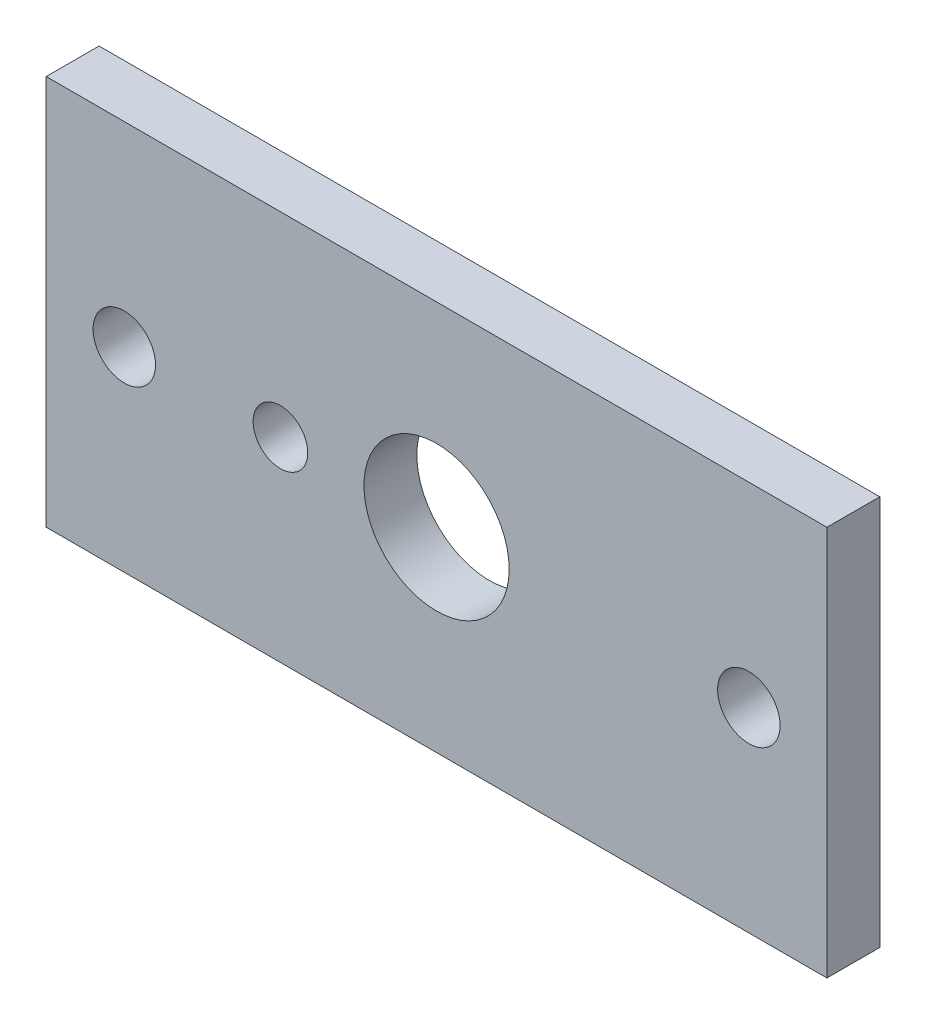
ISO-10303-21;
HEADER;
FILE_DESCRIPTION(('STEP AP214'),'2;1');
FILE_NAME('part.step','',(''),(''),'','','');
FILE_SCHEMA(('AUTOMOTIVE_DESIGN { 1 0 10303 214 1 1 1 1 }'));
ENDSEC;
DATA;
#1=APPLICATION_CONTEXT('core data for automotive mechanical design processes');
#2=APPLICATION_PROTOCOL_DEFINITION('international standard','automotive_design',2000,#1);
#3=PRODUCT_CONTEXT('',#1,'mechanical');
#4=PRODUCT('Part','Part','',(#3));
#5=PRODUCT_RELATED_PRODUCT_CATEGORY('part','',(#4));
#6=PRODUCT_DEFINITION_FORMATION('','',#4);
#7=PRODUCT_DEFINITION_CONTEXT('part definition',#1,'design');
#8=PRODUCT_DEFINITION('design','',#6,#7);
#9=PRODUCT_DEFINITION_SHAPE('','',#8);
#10=(LENGTH_UNIT() NAMED_UNIT(*) SI_UNIT(.MILLI.,.METRE.));
#11=(NAMED_UNIT(*) PLANE_ANGLE_UNIT() SI_UNIT($,.RADIAN.));
#12=(NAMED_UNIT(*) SI_UNIT($,.STERADIAN.) SOLID_ANGLE_UNIT());
#13=UNCERTAINTY_MEASURE_WITH_UNIT(LENGTH_MEASURE(1.E-05),#10,'distance_accuracy_value','');
#14=(GEOMETRIC_REPRESENTATION_CONTEXT(3) GLOBAL_UNCERTAINTY_ASSIGNED_CONTEXT((#13)) GLOBAL_UNIT_ASSIGNED_CONTEXT((#10,
#11,#12)) REPRESENTATION_CONTEXT('',''));
#15=CARTESIAN_POINT('',(0.,0.,0.));
#16=DIRECTION('',(0.,0.,1.));
#17=DIRECTION('',(1.,0.,0.));
#18=AXIS2_PLACEMENT_3D('',#15,#16,#17);
#19=CARTESIAN_POINT('',(0.,0.,3.385));
#20=DIRECTION('',(0.,0.,1.));
#21=DIRECTION('',(1.,0.,0.));
#22=AXIS2_PLACEMENT_3D('',#19,#20,#21);
#23=PLANE('',#22);
#24=CARTESIAN_POINT('',(20.,0.,3.385));
#25=DIRECTION('',(0.,0.,1.));
#26=DIRECTION('',(1.,0.,0.));
#27=AXIS2_PLACEMENT_3D('',#24,#25,#26);
#28=CIRCLE('',#27,2.);
#29=CARTESIAN_POINT('',(22.,0.,3.385));
#30=VERTEX_POINT('',#29);
#31=EDGE_CURVE('E124',#30,#30,#28,.T.);
#32=ORIENTED_EDGE('',*,*,#31,.F.);
#33=EDGE_LOOP('',(#32));
#34=FACE_BOUND('',#33,.T.);
#35=CARTESIAN_POINT('',(0.,0.,3.385));
#36=DIRECTION('',(0.,0.,1.));
#37=DIRECTION('',(1.,0.,0.));
#38=AXIS2_PLACEMENT_3D('',#35,#36,#37);
#39=CIRCLE('',#38,4.65);
#40=CARTESIAN_POINT('',(4.65000000000006,0.,3.385));
#41=VERTEX_POINT('',#40);
#42=EDGE_CURVE('E103',#41,#41,#39,.T.);
#43=ORIENTED_EDGE('',*,*,#42,.F.);
#44=EDGE_LOOP('',(#43));
#45=FACE_BOUND('',#44,.T.);
#46=DIRECTION('',(0.,1.,0.));
#47=VECTOR('',#46,1.);
#48=CARTESIAN_POINT('',(25.,12.5,3.385));
#49=LINE('',#48,#47);
#50=CARTESIAN_POINT('',(25.,-12.5,3.385));
#51=VERTEX_POINT('',#50);
#52=CARTESIAN_POINT('',(25.,12.5,3.385));
#53=VERTEX_POINT('',#52);
#54=EDGE_CURVE('E88',#51,#53,#49,.T.);
#55=ORIENTED_EDGE('',*,*,#54,.T.);
#56=DIRECTION('',(-1.,0.,0.));
#57=VECTOR('',#56,1.);
#58=CARTESIAN_POINT('',(-25.,12.5,3.385));
#59=LINE('',#58,#57);
#60=CARTESIAN_POINT('',(-25.,12.5,3.385));
#61=VERTEX_POINT('',#60);
#62=EDGE_CURVE('E83',#53,#61,#59,.T.);
#63=ORIENTED_EDGE('',*,*,#62,.T.);
#64=DIRECTION('',(0.,-1.,0.));
#65=VECTOR('',#64,1.);
#66=CARTESIAN_POINT('',(-25.,12.5,3.385));
#67=LINE('',#66,#65);
#68=CARTESIAN_POINT('',(-25.,-12.5,3.385));
#69=VERTEX_POINT('',#68);
#70=EDGE_CURVE('E86',#61,#69,#67,.T.);
#71=ORIENTED_EDGE('',*,*,#70,.T.);
#72=DIRECTION('',(1.,0.,0.));
#73=VECTOR('',#72,1.);
#74=CARTESIAN_POINT('',(-25.,-12.5,3.385));
#75=LINE('',#74,#73);
#76=EDGE_CURVE('E53',#69,#51,#75,.T.);
#77=ORIENTED_EDGE('',*,*,#76,.T.);
#78=EDGE_LOOP('',(#55,#63,#71,#77));
#79=FACE_BOUND('',#78,.T.);
#80=CARTESIAN_POINT('',(-10.,0.,3.385));
#81=DIRECTION('',(0.,0.,1.));
#82=DIRECTION('',(1.,0.,0.));
#83=AXIS2_PLACEMENT_3D('',#80,#81,#82);
#84=CIRCLE('',#83,1.75);
#85=CARTESIAN_POINT('',(-8.25,0.,3.385));
#86=VERTEX_POINT('',#85);
#87=EDGE_CURVE('E118',#86,#86,#84,.T.);
#88=ORIENTED_EDGE('',*,*,#87,.F.);
#89=EDGE_LOOP('',(#88));
#90=FACE_BOUND('',#89,.T.);
#91=CARTESIAN_POINT('',(-20.,0.,3.385));
#92=DIRECTION('',(0.,0.,1.));
#93=DIRECTION('',(1.,0.,0.));
#94=AXIS2_PLACEMENT_3D('',#91,#92,#93);
#95=CIRCLE('',#94,2.);
#96=CARTESIAN_POINT('',(-18.,0.,3.385));
#97=VERTEX_POINT('',#96);
#98=EDGE_CURVE('E130',#97,#97,#95,.T.);
#99=ORIENTED_EDGE('',*,*,#98,.F.);
#100=EDGE_LOOP('',(#99));
#101=FACE_BOUND('',#100,.T.);
#102=ADVANCED_FACE('F36',(#34,#45,#79,#90,#101),#23,.T.);
#103=CARTESIAN_POINT('',(0.,0.,0.));
#104=DIRECTION('',(0.,0.,1.));
#105=DIRECTION('',(1.,0.,0.));
#106=AXIS2_PLACEMENT_3D('',#103,#104,#105);
#107=PLANE('',#106);
#108=DIRECTION('',(0.,1.,0.));
#109=VECTOR('',#108,1.);
#110=CARTESIAN_POINT('',(25.,12.5,0.));
#111=LINE('',#110,#109);
#112=CARTESIAN_POINT('',(25.,-12.5,0.));
#113=VERTEX_POINT('',#112);
#114=CARTESIAN_POINT('',(25.,12.5,0.));
#115=VERTEX_POINT('',#114);
#116=EDGE_CURVE('E100',#113,#115,#111,.T.);
#117=ORIENTED_EDGE('',*,*,#116,.F.);
#118=DIRECTION('',(1.,0.,0.));
#119=VECTOR('',#118,1.);
#120=CARTESIAN_POINT('',(-25.,-12.5,0.));
#121=LINE('',#120,#119);
#122=CARTESIAN_POINT('',(-25.,-12.5,0.));
#123=VERTEX_POINT('',#122);
#124=EDGE_CURVE('E76',#123,#113,#121,.T.);
#125=ORIENTED_EDGE('',*,*,#124,.F.);
#126=DIRECTION('',(0.,-1.,0.));
#127=VECTOR('',#126,1.);
#128=CARTESIAN_POINT('',(-25.,12.5,0.));
#129=LINE('',#128,#127);
#130=CARTESIAN_POINT('',(-25.,12.5,0.));
#131=VERTEX_POINT('',#130);
#132=EDGE_CURVE('E70',#131,#123,#129,.T.);
#133=ORIENTED_EDGE('',*,*,#132,.F.);
#134=DIRECTION('',(-1.,0.,0.));
#135=VECTOR('',#134,1.);
#136=CARTESIAN_POINT('',(-25.,12.5,0.));
#137=LINE('',#136,#135);
#138=EDGE_CURVE('E92',#115,#131,#137,.T.);
#139=ORIENTED_EDGE('',*,*,#138,.F.);
#140=EDGE_LOOP('',(#117,#125,#133,#139));
#141=FACE_BOUND('',#140,.T.);
#142=CARTESIAN_POINT('',(0.,0.,0.));
#143=DIRECTION('',(0.,0.,1.));
#144=DIRECTION('',(1.,0.,0.));
#145=AXIS2_PLACEMENT_3D('',#142,#143,#144);
#146=CIRCLE('',#145,4.65);
#147=CARTESIAN_POINT('',(4.65000000000006,0.,0.));
#148=VERTEX_POINT('',#147);
#149=EDGE_CURVE('E115',#148,#148,#146,.T.);
#150=ORIENTED_EDGE('',*,*,#149,.T.);
#151=EDGE_LOOP('',(#150));
#152=FACE_BOUND('',#151,.T.);
#153=CARTESIAN_POINT('',(-10.,0.,0.));
#154=DIRECTION('',(0.,0.,1.));
#155=DIRECTION('',(1.,0.,0.));
#156=AXIS2_PLACEMENT_3D('',#153,#154,#155);
#157=CIRCLE('',#156,1.75);
#158=CARTESIAN_POINT('',(-8.25,0.,0.));
#159=VERTEX_POINT('',#158);
#160=EDGE_CURVE('E121',#159,#159,#157,.T.);
#161=ORIENTED_EDGE('',*,*,#160,.T.);
#162=EDGE_LOOP('',(#161));
#163=FACE_BOUND('',#162,.T.);
#164=CARTESIAN_POINT('',(20.,0.,0.));
#165=DIRECTION('',(0.,0.,1.));
#166=DIRECTION('',(1.,0.,0.));
#167=AXIS2_PLACEMENT_3D('',#164,#165,#166);
#168=CIRCLE('',#167,2.);
#169=CARTESIAN_POINT('',(22.,0.,0.));
#170=VERTEX_POINT('',#169);
#171=EDGE_CURVE('E127',#170,#170,#168,.T.);
#172=ORIENTED_EDGE('',*,*,#171,.T.);
#173=EDGE_LOOP('',(#172));
#174=FACE_BOUND('',#173,.T.);
#175=CARTESIAN_POINT('',(-20.,0.,0.));
#176=DIRECTION('',(0.,0.,1.));
#177=DIRECTION('',(1.,0.,0.));
#178=AXIS2_PLACEMENT_3D('',#175,#176,#177);
#179=CIRCLE('',#178,2.);
#180=CARTESIAN_POINT('',(-18.,0.,0.));
#181=VERTEX_POINT('',#180);
#182=EDGE_CURVE('E133',#181,#181,#179,.T.);
#183=ORIENTED_EDGE('',*,*,#182,.T.);
#184=EDGE_LOOP('',(#183));
#185=FACE_BOUND('',#184,.T.);
#186=ADVANCED_FACE('F111',(#141,#152,#163,#174,#185),#107,.F.);
#187=CARTESIAN_POINT('',(25.,12.5,3.385));
#188=DIRECTION('',(-1.,0.,0.));
#189=DIRECTION('',(0.,0.,1.));
#190=AXIS2_PLACEMENT_3D('',#187,#188,#189);
#191=PLANE('',#190);
#192=ORIENTED_EDGE('',*,*,#116,.T.);
#193=DIRECTION('',(0.,0.,-1.));
#194=VECTOR('',#193,1.);
#195=CARTESIAN_POINT('',(25.,12.5,3.385));
#196=LINE('',#195,#194);
#197=EDGE_CURVE('E11',#53,#115,#196,.T.);
#198=ORIENTED_EDGE('',*,*,#197,.F.);
#199=ORIENTED_EDGE('',*,*,#54,.F.);
#200=DIRECTION('',(0.,0.,-1.));
#201=VECTOR('',#200,1.);
#202=CARTESIAN_POINT('',(25.,-12.5,3.385));
#203=LINE('',#202,#201);
#204=EDGE_CURVE('E96',#51,#113,#203,.T.);
#205=ORIENTED_EDGE('',*,*,#204,.T.);
#206=EDGE_LOOP('',(#192,#198,#199,#205));
#207=FACE_BOUND('',#206,.T.);
#208=ADVANCED_FACE('F38',(#207),#191,.F.);
#209=CARTESIAN_POINT('',(-25.,12.5,3.385));
#210=DIRECTION('',(0.,-1.,0.));
#211=DIRECTION('',(0.,0.,-1.));
#212=AXIS2_PLACEMENT_3D('',#209,#210,#211);
#213=PLANE('',#212);
#214=ORIENTED_EDGE('',*,*,#138,.T.);
#215=DIRECTION('',(0.,0.,-1.));
#216=VECTOR('',#215,1.);
#217=CARTESIAN_POINT('',(-25.,12.5,3.385));
#218=LINE('',#217,#216);
#219=EDGE_CURVE('E45',#61,#131,#218,.T.);
#220=ORIENTED_EDGE('',*,*,#219,.F.);
#221=ORIENTED_EDGE('',*,*,#62,.F.);
#222=ORIENTED_EDGE('',*,*,#197,.T.);
#223=EDGE_LOOP('',(#214,#220,#221,#222));
#224=FACE_BOUND('',#223,.T.);
#225=ADVANCED_FACE('F91',(#224),#213,.F.);
#226=CARTESIAN_POINT('',(-25.,12.5,3.385));
#227=DIRECTION('',(1.,0.,0.));
#228=DIRECTION('',(0.,0.,-1.));
#229=AXIS2_PLACEMENT_3D('',#226,#227,#228);
#230=PLANE('',#229);
#231=ORIENTED_EDGE('',*,*,#132,.T.);
#232=DIRECTION('',(0.,0.,-1.));
#233=VECTOR('',#232,1.);
#234=CARTESIAN_POINT('',(-25.,-12.5,3.385));
#235=LINE('',#234,#233);
#236=EDGE_CURVE('E93',#69,#123,#235,.T.);
#237=ORIENTED_EDGE('',*,*,#236,.F.);
#238=ORIENTED_EDGE('',*,*,#70,.F.);
#239=ORIENTED_EDGE('',*,*,#219,.T.);
#240=EDGE_LOOP('',(#231,#237,#238,#239));
#241=FACE_BOUND('',#240,.T.);
#242=ADVANCED_FACE('F94',(#241),#230,.F.);
#243=CARTESIAN_POINT('',(-25.,-12.5,3.385));
#244=DIRECTION('',(0.,1.,0.));
#245=DIRECTION('',(0.,0.,1.));
#246=AXIS2_PLACEMENT_3D('',#243,#244,#245);
#247=PLANE('',#246);
#248=ORIENTED_EDGE('',*,*,#124,.T.);
#249=ORIENTED_EDGE('',*,*,#204,.F.);
#250=ORIENTED_EDGE('',*,*,#76,.F.);
#251=ORIENTED_EDGE('',*,*,#236,.T.);
#252=EDGE_LOOP('',(#248,#249,#250,#251));
#253=FACE_BOUND('',#252,.T.);
#254=ADVANCED_FACE('F108',(#253),#247,.F.);
#255=CARTESIAN_POINT('',(0.,0.,3.385));
#256=DIRECTION('',(0.,0.,-1.));
#257=DIRECTION('',(-1.,0.,0.));
#258=AXIS2_PLACEMENT_3D('',#255,#256,#257);
#259=CYLINDRICAL_SURFACE('',#258,4.65);
#260=ORIENTED_EDGE('',*,*,#42,.T.);
#261=EDGE_LOOP('',(#260));
#262=FACE_BOUND('',#261,.T.);
#263=ORIENTED_EDGE('',*,*,#149,.F.);
#264=EDGE_LOOP('',(#263));
#265=FACE_BOUND('',#264,.T.);
#266=ADVANCED_FACE('F152',(#262,#265),#259,.F.);
#267=CARTESIAN_POINT('',(-10.,0.,3.385));
#268=DIRECTION('',(0.,0.,-1.));
#269=DIRECTION('',(-1.,0.,0.));
#270=AXIS2_PLACEMENT_3D('',#267,#268,#269);
#271=CYLINDRICAL_SURFACE('',#270,1.75);
#272=ORIENTED_EDGE('',*,*,#87,.T.);
#273=EDGE_LOOP('',(#272));
#274=FACE_BOUND('',#273,.T.);
#275=ORIENTED_EDGE('',*,*,#160,.F.);
#276=EDGE_LOOP('',(#275));
#277=FACE_BOUND('',#276,.T.);
#278=ADVANCED_FACE('F198',(#274,#277),#271,.F.);
#279=CARTESIAN_POINT('',(20.,0.,3.385));
#280=DIRECTION('',(0.,0.,-1.));
#281=DIRECTION('',(-1.,0.,0.));
#282=AXIS2_PLACEMENT_3D('',#279,#280,#281);
#283=CYLINDRICAL_SURFACE('',#282,2.);
#284=ORIENTED_EDGE('',*,*,#31,.T.);
#285=EDGE_LOOP('',(#284));
#286=FACE_BOUND('',#285,.T.);
#287=ORIENTED_EDGE('',*,*,#171,.F.);
#288=EDGE_LOOP('',(#287));
#289=FACE_BOUND('',#288,.T.);
#290=ADVANCED_FACE('F206',(#286,#289),#283,.F.);
#291=CARTESIAN_POINT('',(-20.,0.,3.385));
#292=DIRECTION('',(0.,0.,-1.));
#293=DIRECTION('',(-1.,0.,0.));
#294=AXIS2_PLACEMENT_3D('',#291,#292,#293);
#295=CYLINDRICAL_SURFACE('',#294,2.);
#296=ORIENTED_EDGE('',*,*,#98,.T.);
#297=EDGE_LOOP('',(#296));
#298=FACE_BOUND('',#297,.T.);
#299=ORIENTED_EDGE('',*,*,#182,.F.);
#300=EDGE_LOOP('',(#299));
#301=FACE_BOUND('',#300,.T.);
#302=ADVANCED_FACE('F139',(#298,#301),#295,.F.);
#303=CLOSED_SHELL('',(#102,#186,#208,#225,#242,#254,#266,#278,#290,#302));
#304=MANIFOLD_SOLID_BREP('B2',#303);
#305=ADVANCED_BREP_SHAPE_REPRESENTATION('',(#18,#304),#14);
#306=SHAPE_DEFINITION_REPRESENTATION(#9,#305);
ENDSEC;
END-ISO-10303-21;
